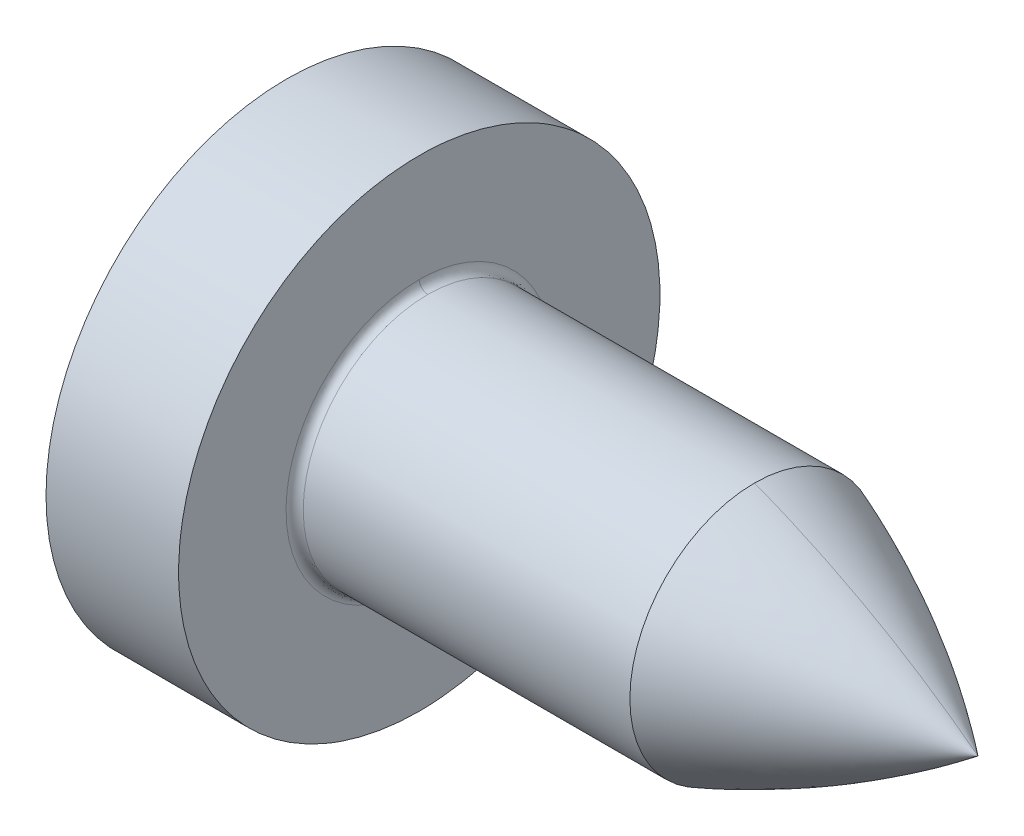
ISO-10303-21;
HEADER;
FILE_DESCRIPTION(('STEP AP214'),'2;1');
FILE_NAME('part.step','',(''),(''),'','','');
FILE_SCHEMA(('AUTOMOTIVE_DESIGN { 1 0 10303 214 1 1 1 1 }'));
ENDSEC;
DATA;
#1=APPLICATION_CONTEXT('core data for automotive mechanical design processes');
#2=APPLICATION_PROTOCOL_DEFINITION('international standard','automotive_design',2000,#1);
#3=PRODUCT_CONTEXT('',#1,'mechanical');
#4=PRODUCT('Part','Part','',(#3));
#5=PRODUCT_RELATED_PRODUCT_CATEGORY('part','',(#4));
#6=PRODUCT_DEFINITION_FORMATION('','',#4);
#7=PRODUCT_DEFINITION_CONTEXT('part definition',#1,'design');
#8=PRODUCT_DEFINITION('design','',#6,#7);
#9=PRODUCT_DEFINITION_SHAPE('','',#8);
#10=(LENGTH_UNIT() NAMED_UNIT(*) SI_UNIT(.MILLI.,.METRE.));
#11=(NAMED_UNIT(*) PLANE_ANGLE_UNIT() SI_UNIT($,.RADIAN.));
#12=(NAMED_UNIT(*) SI_UNIT($,.STERADIAN.) SOLID_ANGLE_UNIT());
#13=UNCERTAINTY_MEASURE_WITH_UNIT(LENGTH_MEASURE(1.E-05),#10,'distance_accuracy_value','');
#14=(GEOMETRIC_REPRESENTATION_CONTEXT(3) GLOBAL_UNCERTAINTY_ASSIGNED_CONTEXT((#13)) GLOBAL_UNIT_ASSIGNED_CONTEXT((#10,
#11,#12)) REPRESENTATION_CONTEXT('',''));
#15=CARTESIAN_POINT('',(0.,0.,0.));
#16=DIRECTION('',(0.,0.,1.));
#17=DIRECTION('',(1.,0.,0.));
#18=AXIS2_PLACEMENT_3D('',#15,#16,#17);
#19=CARTESIAN_POINT('',(1.75,-0.489637029,0.489637029));
#20=DIRECTION('',(1.,0.,0.));
#21=DIRECTION('',(0.,0.,-1.));
#22=AXIS2_PLACEMENT_3D('',#19,#20,#21);
#23=PLANE('',#22);
#24=DIRECTION('',(0.,0.,-1.));
#25=VECTOR('',#24,1.);
#26=CARTESIAN_POINT('',(1.75,0.3,-0.3));
#27=LINE('',#26,#25);
#28=CARTESIAN_POINT('',(1.75,0.3,-0.489637029));
#29=VERTEX_POINT('',#28);
#30=CARTESIAN_POINT('',(1.75,0.3,-0.3));
#31=VERTEX_POINT('',#30);
#32=EDGE_CURVE('E134',#29,#31,#27,.F.);
#33=ORIENTED_EDGE('',*,*,#32,.F.);
#34=DIRECTION('',(0.,1.,0.));
#35=VECTOR('',#34,1.);
#36=CARTESIAN_POINT('',(1.75,-0.3,-0.489637029));
#37=LINE('',#36,#35);
#38=CARTESIAN_POINT('',(1.75,-0.3,-0.489637029));
#39=VERTEX_POINT('',#38);
#40=EDGE_CURVE('E149',#39,#29,#37,.T.);
#41=ORIENTED_EDGE('',*,*,#40,.F.);
#42=DIRECTION('',(0.,0.,1.));
#43=VECTOR('',#42,1.);
#44=CARTESIAN_POINT('',(1.75,-0.3,-1.38860227));
#45=LINE('',#44,#43);
#46=CARTESIAN_POINT('',(1.75,-0.3,-0.3));
#47=VERTEX_POINT('',#46);
#48=EDGE_CURVE('E164',#47,#39,#45,.F.);
#49=ORIENTED_EDGE('',*,*,#48,.F.);
#50=DIRECTION('',(0.,-1.,0.));
#51=VECTOR('',#50,1.);
#52=CARTESIAN_POINT('',(1.75,-0.3,-0.3));
#53=LINE('',#52,#51);
#54=CARTESIAN_POINT('',(1.75,-0.489637029,-0.3));
#55=VERTEX_POINT('',#54);
#56=EDGE_CURVE('E172',#55,#47,#53,.F.);
#57=ORIENTED_EDGE('',*,*,#56,.F.);
#58=DIRECTION('',(0.,0.,1.));
#59=VECTOR('',#58,1.);
#60=CARTESIAN_POINT('',(1.75,-0.489637029,-0.3));
#61=LINE('',#60,#59);
#62=CARTESIAN_POINT('',(1.75,-0.489637029,0.3));
#63=VERTEX_POINT('',#62);
#64=EDGE_CURVE('E180',#63,#55,#61,.F.);
#65=ORIENTED_EDGE('',*,*,#64,.F.);
#66=DIRECTION('',(0.,1.,0.));
#67=VECTOR('',#66,1.);
#68=CARTESIAN_POINT('',(1.75,-1.38860227,0.3));
#69=LINE('',#68,#67);
#70=CARTESIAN_POINT('',(1.75,-0.3,0.3));
#71=VERTEX_POINT('',#70);
#72=EDGE_CURVE('E188',#71,#63,#69,.F.);
#73=ORIENTED_EDGE('',*,*,#72,.F.);
#74=DIRECTION('',(0.,0.,1.));
#75=VECTOR('',#74,1.);
#76=CARTESIAN_POINT('',(1.75,-0.3,0.3));
#77=LINE('',#76,#75);
#78=CARTESIAN_POINT('',(1.75,-0.3,0.489637029));
#79=VERTEX_POINT('',#78);
#80=EDGE_CURVE('E196',#79,#71,#77,.F.);
#81=ORIENTED_EDGE('',*,*,#80,.F.);
#82=DIRECTION('',(0.,1.,0.));
#83=VECTOR('',#82,1.);
#84=CARTESIAN_POINT('',(1.75,-0.3,0.489637029));
#85=LINE('',#84,#83);
#86=CARTESIAN_POINT('',(1.75,0.3,0.489637029));
#87=VERTEX_POINT('',#86);
#88=EDGE_CURVE('E204',#87,#79,#85,.F.);
#89=ORIENTED_EDGE('',*,*,#88,.F.);
#90=DIRECTION('',(0.,0.,-1.));
#91=VECTOR('',#90,1.);
#92=CARTESIAN_POINT('',(1.75,0.3,1.38860227));
#93=LINE('',#92,#91);
#94=CARTESIAN_POINT('',(1.75,0.3,0.3));
#95=VERTEX_POINT('',#94);
#96=EDGE_CURVE('E212',#95,#87,#93,.F.);
#97=ORIENTED_EDGE('',*,*,#96,.F.);
#98=DIRECTION('',(0.,1.,0.));
#99=VECTOR('',#98,1.);
#100=CARTESIAN_POINT('',(1.75,0.3,0.3));
#101=LINE('',#100,#99);
#102=CARTESIAN_POINT('',(1.75,0.489637029,0.3));
#103=VERTEX_POINT('',#102);
#104=EDGE_CURVE('E220',#103,#95,#101,.F.);
#105=ORIENTED_EDGE('',*,*,#104,.F.);
#106=DIRECTION('',(0.,0.,1.));
#107=VECTOR('',#106,1.);
#108=CARTESIAN_POINT('',(1.75,0.489637029,-0.3));
#109=LINE('',#108,#107);
#110=CARTESIAN_POINT('',(1.75,0.489637029,-0.3));
#111=VERTEX_POINT('',#110);
#112=EDGE_CURVE('E137',#111,#103,#109,.T.);
#113=ORIENTED_EDGE('',*,*,#112,.F.);
#114=DIRECTION('',(0.,-1.,0.));
#115=VECTOR('',#114,1.);
#116=CARTESIAN_POINT('',(1.75,1.38860227,-0.3));
#117=LINE('',#116,#115);
#118=EDGE_CURVE('E22',#31,#111,#117,.F.);
#119=ORIENTED_EDGE('',*,*,#118,.F.);
#120=EDGE_LOOP('',(#33,#41,#49,#57,#65,#73,#81,#89,#97,#105,#113,#119));
#121=FACE_BOUND('',#120,.T.);
#122=ADVANCED_FACE('F17',(#121),#23,.F.);
#123=CARTESIAN_POINT('',(0.007640712,1.38860227,-0.3));
#124=DIRECTION('',(0.,0.,1.));
#125=DIRECTION('',(0.,-1.,0.));
#126=AXIS2_PLACEMENT_3D('',#123,#124,#125);
#127=PLANE('',#126);
#128=ORIENTED_EDGE('',*,*,#118,.T.);
#129=DIRECTION('',(0.866025403776481,-0.500000000013782,0.));
#130=VECTOR('',#129,1.);
#131=CARTESIAN_POINT('',(0.186832105,1.392132434,-0.3));
#132=LINE('',#131,#130);
#133=CARTESIAN_POINT('',(0.204192136543813,1.38210961511467,-0.300000005057654));
#134=VERTEX_POINT('',#133);
#135=EDGE_CURVE('E228',#134,#111,#132,.T.);
#136=ORIENTED_EDGE('',*,*,#135,.F.);
#137=CARTESIAN_POINT('',(0.204192145400716,1.38210962725965,-0.3));
#138=CARTESIAN_POINT('',(0.191463387385379,1.33794250009717,-0.3));
#139=CARTESIAN_POINT('',(0.179345099389137,1.29359945410167,-0.3));
#140=CARTESIAN_POINT('',(0.156364101310373,1.20469663715095,-0.3));
#141=CARTESIAN_POINT('',(0.145498601955383,1.16013758719818,-0.3));
#142=CARTESIAN_POINT('',(0.125015443208429,1.07080460369255,-0.3));
#143=CARTESIAN_POINT('',(0.115395919605229,1.02603109757912,-0.3));
#144=CARTESIAN_POINT('',(0.0973995356519955,0.936270408464885,-0.3));
#145=CARTESIAN_POINT('',(0.0890217371712165,0.89128341355061,-0.3));
#146=CARTESIAN_POINT('',(0.0735064456092174,0.801096049043632,-0.3));
#147=CARTESIAN_POINT('',(0.0663689525279974,0.755895679450928,-0.3));
#148=CARTESIAN_POINT('',(0.0533347009533749,0.665281334937799,-0.3));
#149=CARTESIAN_POINT('',(0.0474388895119803,0.619867223788404,-0.3));
#150=CARTESIAN_POINT('',(0.036891377921522,0.528824971325505,-0.3));
#151=CARTESIAN_POINT('',(0.0322415776510665,0.483196609900054,-0.3));
#152=CARTESIAN_POINT('',(0.0241920568768406,0.391725071431656,-0.3));
#153=CARTESIAN_POINT('',(0.0207952062334372,0.345881641828002,-0.3));
#154=CARTESIAN_POINT('',(0.0180325178902483,0.300000012001697,-0.3));
#155=B_SPLINE_CURVE_WITH_KNOTS('',3,(#137,#138,#139,#140,#141,#142,#143,#144,#145,#146,#147,
#148,#149,#150,#151,#152,#153,#154),.UNSPECIFIED.,.F.,.F.,(4,2,2,2,2,2,2,2,4),(0.,
0.137889778040264,0.275466367691533,0.412834679138108,0.550098673118241,0.687362667098374,
0.824730978544949,0.962307568196218,1.10019734623648),.UNSPECIFIED.);
#156=CARTESIAN_POINT('',(0.0180325176455636,0.300000006000848,-0.3));
#157=VERTEX_POINT('',#156);
#158=EDGE_CURVE('E145',#134,#157,#155,.T.);
#159=ORIENTED_EDGE('',*,*,#158,.T.);
#160=DIRECTION('',(1.,0.,0.));
#161=VECTOR('',#160,1.);
#162=CARTESIAN_POINT('',(0.007640712,0.3,-0.3));
#163=LINE('',#162,#161);
#164=EDGE_CURVE('E142',#31,#157,#163,.F.);
#165=ORIENTED_EDGE('',*,*,#164,.F.);
#166=EDGE_LOOP('',(#128,#136,#159,#165));
#167=FACE_BOUND('',#166,.T.);
#168=ADVANCED_FACE('F143',(#167),#127,.T.);
#169=CARTESIAN_POINT('',(0.007640712,0.3,-0.3));
#170=DIRECTION('',(0.,-1.,0.));
#171=DIRECTION('',(0.,0.,-1.));
#172=AXIS2_PLACEMENT_3D('',#169,#170,#171);
#173=PLANE('',#172);
#174=ORIENTED_EDGE('',*,*,#32,.T.);
#175=ORIENTED_EDGE('',*,*,#164,.T.);
#176=CARTESIAN_POINT('',(0.0180325178854787,0.299999999999999,-0.300000011922494));
#177=CARTESIAN_POINT('',(0.0265822573073342,0.299999999999999,-0.442350741842299));
#178=CARTESIAN_POINT('',(0.0412757345976917,0.3,-0.58434877076873));
#179=CARTESIAN_POINT('',(0.0826542120601617,0.3,-0.865906856408898));
#180=CARTESIAN_POINT('',(0.109282675724778,0.3,-1.00547522135275));
#181=CARTESIAN_POINT('',(0.160629730936378,0.3,-1.2236331611432));
#182=CARTESIAN_POINT('',(0.181433121631465,0.3,-1.30315866849996));
#183=CARTESIAN_POINT('',(0.204192145406173,0.3,-1.38210962727859));
#184=B_SPLINE_CURVE_WITH_KNOTS('',3,(#176,#177,#178,#179,#180,#181,#182,#183),.UNSPECIFIED.,.F.,
.F.,(4,2,2,4),(0.,0.42772574094884,0.853446397968329,1.09994692993913),.UNSPECIFIED.);
#185=CARTESIAN_POINT('',(0.204192143290822,0.3,-1.38210961985958));
#186=VERTEX_POINT('',#185);
#187=EDGE_CURVE('E246',#157,#186,#184,.T.);
#188=ORIENTED_EDGE('',*,*,#187,.T.);
#189=DIRECTION('',(0.866025403776481,0.,0.500000000013782));
#190=VECTOR('',#189,1.);
#191=CARTESIAN_POINT('',(0.186832105,0.3,-1.392132434));
#192=LINE('',#191,#190);
#193=EDGE_CURVE('E153',#29,#186,#192,.F.);
#194=ORIENTED_EDGE('',*,*,#193,.F.);
#195=EDGE_LOOP('',(#174,#175,#188,#194));
#196=FACE_BOUND('',#195,.T.);
#197=ADVANCED_FACE('F151',(#196),#173,.T.);
#198=CARTESIAN_POINT('',(0.186832105,-0.3,-1.392132434));
#199=DIRECTION('',(-0.500000000013782,0.,0.866025403776481));
#200=DIRECTION('',(0.866025403776481,0.,0.500000000013782));
#201=AXIS2_PLACEMENT_3D('',#198,#199,#200);
#202=PLANE('',#201);
#203=ORIENTED_EDGE('',*,*,#40,.T.);
#204=ORIENTED_EDGE('',*,*,#193,.T.);
#205=CARTESIAN_POINT('',(0.204192141299821,0.30000000304568,-1.38210961236879));
#206=CARTESIAN_POINT('',(0.19883416324687,0.200000001998752,-1.38520304244008));
#207=CARTESIAN_POINT('',(0.196155174221242,0.100000000951884,-1.38674975747524));
#208=CARTESIAN_POINT('',(0.196155174224629,-0.100000001141731,-1.38674975747329));
#209=CARTESIAN_POINT('',(0.198834163253646,-0.200000002188477,-1.38520304243618));
#210=CARTESIAN_POINT('',(0.204192141309985,-0.300000003235164,-1.38210961236293));
#211=B_SPLINE_CURVE_WITH_KNOTS('',3,(#205,#206,#207,#208,#209,#210),.UNSPECIFIED.,.F.,.F.,(4,2,
4),(0.,0.300143508460131,0.600287016920263),.UNSPECIFIED.);
#212=CARTESIAN_POINT('',(0.204192141216119,-0.300000001617604,-1.38210961241711));
#213=VERTEX_POINT('',#212);
#214=EDGE_CURVE('E271',#186,#213,#211,.T.);
#215=ORIENTED_EDGE('',*,*,#214,.T.);
#216=DIRECTION('',(-0.866025403776481,0.,-0.500000000013782));
#217=VECTOR('',#216,1.);
#218=CARTESIAN_POINT('',(1.74999999999279,-0.3,-0.489637029004161));
#219=LINE('',#218,#217);
#220=EDGE_CURVE('E168',#39,#213,#219,.T.);
#221=ORIENTED_EDGE('',*,*,#220,.F.);
#222=EDGE_LOOP('',(#203,#204,#215,#221));
#223=FACE_BOUND('',#222,.T.);
#224=ADVANCED_FACE('F263',(#223),#202,.T.);
#225=CARTESIAN_POINT('',(0.007640712,-0.3,-1.38860227));
#226=DIRECTION('',(0.,1.,0.));
#227=DIRECTION('',(0.,0.,1.));
#228=AXIS2_PLACEMENT_3D('',#225,#226,#227);
#229=PLANE('',#228);
#230=ORIENTED_EDGE('',*,*,#48,.T.);
#231=ORIENTED_EDGE('',*,*,#220,.T.);
#232=CARTESIAN_POINT('',(0.204192145395258,-0.3,-1.38210962724071));
#233=CARTESIAN_POINT('',(0.191463387380087,-0.3,-1.33794250007815));
#234=CARTESIAN_POINT('',(0.179345099384013,-0.3,-1.29359945408257));
#235=CARTESIAN_POINT('',(0.156364101305585,-0.3,-1.2046966371317));
#236=CARTESIAN_POINT('',(0.145498601950764,-0.3,-1.16013758717885));
#237=CARTESIAN_POINT('',(0.125015443204153,-0.3,-1.07080460367308));
#238=CARTESIAN_POINT('',(0.115395919601125,-0.3,-1.02603109755958));
#239=CARTESIAN_POINT('',(0.0973995356482388,-0.3,-0.936270408445212));
#240=CARTESIAN_POINT('',(0.0890217371676343,-0.3,-0.891283413530873));
#241=CARTESIAN_POINT('',(0.0735064456059871,-0.3,-0.801096049023769));
#242=CARTESIAN_POINT('',(0.0663689525249444,-0.3,-0.755895679431005));
#243=CARTESIAN_POINT('',(0.0533347009506796,-0.3,-0.665281334917761));
#244=CARTESIAN_POINT('',(0.0474388895094651,-0.3,-0.61986722376831));
#245=CARTESIAN_POINT('',(0.0368913779193694,-0.3,-0.528824971305305));
#246=CARTESIAN_POINT('',(0.0322415776490963,-0.3,-0.483196609879803));
#247=CARTESIAN_POINT('',(0.0241920568752379,-0.3,-0.391725071411308));
#248=CARTESIAN_POINT('',(0.0207952062320198,-0.3,-0.345881641807608));
#249=CARTESIAN_POINT('',(0.0180325178890176,-0.3,-0.30000001198126));
#250=B_SPLINE_CURVE_WITH_KNOTS('',3,(#232,#233,#234,#235,#236,#237,#238,#239,#240,#241,#242,
#243,#244,#245,#246,#247,#248,#249),.UNSPECIFIED.,.F.,.F.,(4,2,2,2,2,2,2,2,4),(0.,
0.137889778040361,0.275466367691726,0.412834679138397,0.550098673118625,0.687362667098853,
0.824730978545524,0.962307568196888,1.10019734623725),.UNSPECIFIED.);
#251=CARTESIAN_POINT('',(0.0180325176449482,-0.299999999999999,-0.30000000599063));
#252=VERTEX_POINT('',#251);
#253=EDGE_CURVE('E278',#213,#252,#250,.T.);
#254=ORIENTED_EDGE('',*,*,#253,.T.);
#255=DIRECTION('',(1.,0.,0.));
#256=VECTOR('',#255,1.);
#257=CARTESIAN_POINT('',(0.007640712,-0.3,-0.3));
#258=LINE('',#257,#256);
#259=EDGE_CURVE('E176',#47,#252,#258,.F.);
#260=ORIENTED_EDGE('',*,*,#259,.F.);
#261=EDGE_LOOP('',(#230,#231,#254,#260));
#262=FACE_BOUND('',#261,.T.);
#263=ADVANCED_FACE('F267',(#262),#229,.T.);
#264=CARTESIAN_POINT('',(0.007640712,-0.3,-0.3));
#265=DIRECTION('',(0.,0.,1.));
#266=DIRECTION('',(0.,-1.,0.));
#267=AXIS2_PLACEMENT_3D('',#264,#265,#266);
#268=PLANE('',#267);
#269=ORIENTED_EDGE('',*,*,#56,.T.);
#270=ORIENTED_EDGE('',*,*,#259,.T.);
#271=CARTESIAN_POINT('',(0.0180325178867095,-0.300000011942931,-0.3));
#272=CARTESIAN_POINT('',(0.0265822573094413,-0.442350741867617,-0.3));
#273=CARTESIAN_POINT('',(0.041275734601102,-0.584348770798885,-0.3));
#274=CARTESIAN_POINT('',(0.0826542120669903,-0.865906856448473,-0.3));
#275=CARTESIAN_POINT('',(0.109282675733715,-1.00547522139691,-0.3));
#276=CARTESIAN_POINT('',(0.160629730946309,-1.22363316118179,-0.3));
#277=CARTESIAN_POINT('',(0.1814331216394,-1.30315866852866,-0.3));
#278=CARTESIAN_POINT('',(0.204192145411631,-1.38210962729753,-0.3));
#279=B_SPLINE_CURVE_WITH_KNOTS('',3,(#271,#272,#273,#274,#275,#276,#277,#278),.UNSPECIFIED.,.F.,
.F.,(4,2,2,4),(0.,0.427725740963614,0.85344639799774,1.09994692993835),.UNSPECIFIED.);
#280=CARTESIAN_POINT('',(0.204192143293551,-1.38210961986905,-0.3));
#281=VERTEX_POINT('',#280);
#282=EDGE_CURVE('E285',#252,#281,#279,.T.);
#283=ORIENTED_EDGE('',*,*,#282,.T.);
#284=DIRECTION('',(-0.866025403776481,-0.500000000013782,0.));
#285=VECTOR('',#284,1.);
#286=CARTESIAN_POINT('',(1.75,-0.489637029,-0.3));
#287=LINE('',#286,#285);
#288=EDGE_CURVE('E184',#55,#281,#287,.T.);
#289=ORIENTED_EDGE('',*,*,#288,.F.);
#290=EDGE_LOOP('',(#269,#270,#283,#289));
#291=FACE_BOUND('',#290,.T.);
#292=ADVANCED_FACE('F300',(#291),#268,.T.);
#293=CARTESIAN_POINT('',(1.75,-0.489637029,-0.3));
#294=DIRECTION('',(-0.500000000013782,0.866025403776481,0.));
#295=DIRECTION('',(-0.866025403776481,-0.500000000013782,0.));
#296=AXIS2_PLACEMENT_3D('',#293,#294,#295);
#297=PLANE('',#296);
#298=ORIENTED_EDGE('',*,*,#64,.T.);
#299=ORIENTED_EDGE('',*,*,#288,.T.);
#300=CARTESIAN_POINT('',(0.204192131858866,-1.38210961781953,-0.300000009548356));
#301=CARTESIAN_POINT('',(0.196155164116408,-1.38674976330927,-0.150143544062612));
#302=CARTESIAN_POINT('',(0.196155164143077,-1.38674976329388,5.6885426273981E-10));
#303=B_SPLINE_CURVE_WITH_KNOTS('',2,(#300,#301,#302),.UNSPECIFIED.,.F.,.F.,(3,3),(0.,1.),.UNSPECIFIED.);
#304=CARTESIAN_POINT('',(0.196155169183007,-1.38674976038407,5.68854261120681E-10));
#305=VERTEX_POINT('',#304);
#306=EDGE_CURVE('E292',#281,#305,#303,.T.);
#307=ORIENTED_EDGE('',*,*,#306,.T.);
#308=CARTESIAN_POINT('',(0.196155164143077,-1.38674976329388,5.6885426273981E-10));
#309=CARTESIAN_POINT('',(0.196155164169747,-1.38674976327848,0.150143543995877));
#310=CARTESIAN_POINT('',(0.204192131835537,-1.382109617833,0.300000009300148));
#311=B_SPLINE_CURVE_WITH_KNOTS('',2,(#308,#309,#310),.UNSPECIFIED.,.F.,.F.,(3,3),(0.,1.),.UNSPECIFIED.);
#312=CARTESIAN_POINT('',(0.204192136478894,-1.38210961515215,0.300000004650074));
#313=VERTEX_POINT('',#312);
#314=EDGE_CURVE('E314',#305,#313,#311,.T.);
#315=ORIENTED_EDGE('',*,*,#314,.T.);
#316=DIRECTION('',(-0.866025403776482,-0.500000000013782,0.));
#317=VECTOR('',#316,1.);
#318=CARTESIAN_POINT('',(1.74999999999279,-0.48963702900416,0.3));
#319=LINE('',#318,#317);
#320=EDGE_CURVE('E192',#63,#313,#319,.T.);
#321=ORIENTED_EDGE('',*,*,#320,.F.);
#322=EDGE_LOOP('',(#298,#299,#307,#315,#321));
#323=FACE_BOUND('',#322,.T.);
#324=ADVANCED_FACE('F304',(#323),#297,.T.);
#325=CARTESIAN_POINT('',(0.007640712,-1.38860227,0.3));
#326=DIRECTION('',(0.,0.,-1.));
#327=DIRECTION('',(0.,1.,0.));
#328=AXIS2_PLACEMENT_3D('',#325,#326,#327);
#329=PLANE('',#328);
#330=ORIENTED_EDGE('',*,*,#72,.T.);
#331=ORIENTED_EDGE('',*,*,#320,.T.);
#332=CARTESIAN_POINT('',(0.20419214541641,-1.38210962731411,0.300000000000001));
#333=CARTESIAN_POINT('',(0.191463387399435,-1.33794250014783,0.3));
#334=CARTESIAN_POINT('',(0.179345099401664,-1.2935994541485,0.3));
#335=CARTESIAN_POINT('',(0.156364101320064,-1.20469663719007,0.3));
#336=CARTESIAN_POINT('',(0.145498601963767,-1.16013758723342,0.3));
#337=CARTESIAN_POINT('',(0.125015443214423,-1.07080460372001,0.3));
#338=CARTESIAN_POINT('',(0.115395919610137,-1.02603109760266,0.3));
#339=CARTESIAN_POINT('',(0.0973995356549516,-0.936270408480561,0.3));
#340=CARTESIAN_POINT('',(0.0890217371733062,-0.891283413562333,0.3));
#341=CARTESIAN_POINT('',(0.0735064456097936,-0.801096049047407,0.3));
#342=CARTESIAN_POINT('',(0.0663689525279263,-0.75589567945071,0.3));
#343=CARTESIAN_POINT('',(0.0533347009522287,-0.665281334929555,0.3));
#344=CARTESIAN_POINT('',(0.0474388895104063,-0.619867223776126,0.3));
#345=CARTESIAN_POINT('',(0.0368913779193125,-0.528824971305121,0.3));
#346=CARTESIAN_POINT('',(0.0322415776486497,-0.483196609875597,0.3));
#347=CARTESIAN_POINT('',(0.0241920568742321,-0.391725071399012,0.3));
#348=CARTESIAN_POINT('',(0.0207952062308452,-0.345881641791245,0.3));
#349=CARTESIAN_POINT('',(0.0180325178877868,-0.300000011960825,0.3));
#350=B_SPLINE_CURVE_WITH_KNOTS('',3,(#332,#333,#334,#335,#336,#337,#338,#339,#340,#341,#342,
#343,#344,#345,#346,#347,#348,#349),.UNSPECIFIED.,.F.,.F.,(4,2,2,2,2,2,2,2,4),(0.,
0.137889778052563,0.275466367716046,0.412834679174781,0.550098673167046,0.68736266715931,
0.824730978618045,0.962307568281528,1.10019734633409),.UNSPECIFIED.);
#351=CARTESIAN_POINT('',(0.0180325176443328,-0.300000005980412,0.3));
#352=VERTEX_POINT('',#351);
#353=EDGE_CURVE('E293',#313,#352,#350,.T.);
#354=ORIENTED_EDGE('',*,*,#353,.T.);
#355=DIRECTION('',(1.,0.,0.));
#356=VECTOR('',#355,1.);
#357=CARTESIAN_POINT('',(0.007640712,-0.3,0.3));
#358=LINE('',#357,#356);
#359=EDGE_CURVE('E200',#71,#352,#358,.F.);
#360=ORIENTED_EDGE('',*,*,#359,.F.);
#361=EDGE_LOOP('',(#330,#331,#354,#360));
#362=FACE_BOUND('',#361,.T.);
#363=ADVANCED_FACE('F308',(#362),#329,.T.);
#364=CARTESIAN_POINT('',(0.007640712,-0.3,0.3));
#365=DIRECTION('',(0.,1.,0.));
#366=DIRECTION('',(0.,0.,1.));
#367=AXIS2_PLACEMENT_3D('',#364,#365,#366);
#368=PLANE('',#367);
#369=ORIENTED_EDGE('',*,*,#80,.T.);
#370=ORIENTED_EDGE('',*,*,#359,.T.);
#371=CARTESIAN_POINT('',(0.0180325178879394,-0.299999999999999,0.300000011963366));
#372=CARTESIAN_POINT('',(0.0265822573115483,-0.3,0.442350741892932));
#373=CARTESIAN_POINT('',(0.0412757346045123,-0.3,0.584348770829036));
#374=CARTESIAN_POINT('',(0.0826542120738179,-0.3,0.865906856488043));
#375=CARTESIAN_POINT('',(0.109282675742651,-0.3,1.00547522144106));
#376=CARTESIAN_POINT('',(0.160629730956238,-0.3,1.22363316122038));
#377=CARTESIAN_POINT('',(0.181433121647335,-0.3,1.30315866855736));
#378=CARTESIAN_POINT('',(0.204192145417089,-0.3,1.38210962731646));
#379=B_SPLINE_CURVE_WITH_KNOTS('',3,(#371,#372,#373,#374,#375,#376,#377,#378),.UNSPECIFIED.,.F.,
.F.,(4,2,2,4),(0.,0.427725740978385,0.853446398027146,1.09994692993756),.UNSPECIFIED.);
#380=CARTESIAN_POINT('',(0.20419214329628,-0.3,1.38210961987852));
#381=VERTEX_POINT('',#380);
#382=EDGE_CURVE('E992',#352,#381,#379,.T.);
#383=ORIENTED_EDGE('',*,*,#382,.T.);
#384=DIRECTION('',(-0.866025403776481,0.,0.500000000013782));
#385=VECTOR('',#384,1.);
#386=CARTESIAN_POINT('',(1.75,-0.3,0.489637029));
#387=LINE('',#386,#385);
#388=EDGE_CURVE('E208',#79,#381,#387,.T.);
#389=ORIENTED_EDGE('',*,*,#388,.F.);
#390=EDGE_LOOP('',(#369,#370,#383,#389));
#391=FACE_BOUND('',#390,.T.);
#392=ADVANCED_FACE('F445',(#391),#368,.T.);
#393=CARTESIAN_POINT('',(1.75,-0.3,0.489637029));
#394=DIRECTION('',(-0.500000000013782,0.,-0.866025403776481));
#395=DIRECTION('',(-0.866025403776481,0.,0.500000000013782));
#396=AXIS2_PLACEMENT_3D('',#393,#394,#395);
#397=PLANE('',#396);
#398=ORIENTED_EDGE('',*,*,#88,.T.);
#399=ORIENTED_EDGE('',*,*,#388,.T.);
#400=CARTESIAN_POINT('',(0.204192141289657,-0.300000002856153,1.38210961237466));
#401=CARTESIAN_POINT('',(0.198834163244223,-0.200000001886282,1.38520304244161));
#402=CARTESIAN_POINT('',(0.196155174221983,-0.100000000916446,1.38674975747482));
#403=CARTESIAN_POINT('',(0.196155174223888,0.10000000102316,1.38674975747372));
#404=CARTESIAN_POINT('',(0.198834163248033,0.200000001992929,1.38520304243942));
#405=CARTESIAN_POINT('',(0.204192141295371,0.300000002962663,1.38210961237136));
#406=B_SPLINE_CURVE_WITH_KNOTS('',3,(#400,#401,#402,#403,#404,#405),.UNSPECIFIED.,.F.,.F.,(4,2,
4),(0.,0.300143508228786,0.600287016457572),.UNSPECIFIED.);
#407=CARTESIAN_POINT('',(0.204192141208812,0.300000001481353,1.38210961242133));
#408=VERTEX_POINT('',#407);
#409=EDGE_CURVE('E997',#381,#408,#406,.T.);
#410=ORIENTED_EDGE('',*,*,#409,.T.);
#411=DIRECTION('',(-0.866025403776482,0.,0.500000000013782));
#412=VECTOR('',#411,1.);
#413=CARTESIAN_POINT('',(1.74999999999279,0.3,0.48963702900416));
#414=LINE('',#413,#412);
#415=EDGE_CURVE('E216',#87,#408,#414,.T.);
#416=ORIENTED_EDGE('',*,*,#415,.F.);
#417=EDGE_LOOP('',(#398,#399,#410,#416));
#418=FACE_BOUND('',#417,.T.);
#419=ADVANCED_FACE('F435',(#418),#397,.T.);
#420=CARTESIAN_POINT('',(0.007640712,0.3,1.38860227));
#421=DIRECTION('',(0.,-1.,0.));
#422=DIRECTION('',(0.,0.,-1.));
#423=AXIS2_PLACEMENT_3D('',#420,#421,#422);
#424=PLANE('',#423);
#425=ORIENTED_EDGE('',*,*,#96,.T.);
#426=ORIENTED_EDGE('',*,*,#415,.T.);
#427=CARTESIAN_POINT('',(0.204192145410951,0.3,1.38210962729517));
#428=CARTESIAN_POINT('',(0.191463387394144,0.3,1.33794250012881));
#429=CARTESIAN_POINT('',(0.17934509939654,0.3,1.2935994541294));
#430=CARTESIAN_POINT('',(0.156364101315275,0.3,1.20469663717081));
#431=CARTESIAN_POINT('',(0.145498601959148,0.3,1.1601375872141));
#432=CARTESIAN_POINT('',(0.125015443210145,0.3,1.07080460370054));
#433=CARTESIAN_POINT('',(0.115395919606032,0.3,1.02603109758312));
#434=CARTESIAN_POINT('',(0.0973995356511942,0.3,0.936270408460887));
#435=CARTESIAN_POINT('',(0.089021737169724,0.3,0.891283413542594));
#436=CARTESIAN_POINT('',(0.0735064456065636,0.3,0.801096049027544));
#437=CARTESIAN_POINT('',(0.0663689525248734,0.3,0.755895679430786));
#438=CARTESIAN_POINT('',(0.0533347009495331,0.3,0.665281334909515));
#439=CARTESIAN_POINT('',(0.047438889507891,0.3,0.619867223756032));
#440=CARTESIAN_POINT('',(0.0368913779171598,0.3,0.52882497128492));
#441=CARTESIAN_POINT('',(0.0322415776466795,0.3,0.483196609855345));
#442=CARTESIAN_POINT('',(0.0241920568726294,0.3,0.391725071378664));
#443=CARTESIAN_POINT('',(0.0207952062294277,0.3,0.345881641770851));
#444=CARTESIAN_POINT('',(0.018032517886556,0.3,0.300000011940387));
#445=B_SPLINE_CURVE_WITH_KNOTS('',3,(#427,#428,#429,#430,#431,#432,#433,#434,#435,#436,#437,
#438,#439,#440,#441,#442,#443,#444),.UNSPECIFIED.,.F.,.F.,(4,2,2,2,2,2,2,2,4),(0.,
0.137889778052659,0.275466367716238,0.412834679175069,0.550098673167428,0.687362667159788,
0.824730978618618,0.962307568282197,1.10019734633486),.UNSPECIFIED.);
#446=CARTESIAN_POINT('',(0.0180325176437175,0.299999999999999,0.300000005970194));
#447=VERTEX_POINT('',#446);
#448=EDGE_CURVE('E372',#408,#447,#445,.T.);
#449=ORIENTED_EDGE('',*,*,#448,.T.);
#450=DIRECTION('',(1.,0.,0.));
#451=VECTOR('',#450,1.);
#452=CARTESIAN_POINT('',(0.007640712,0.3,0.3));
#453=LINE('',#452,#451);
#454=EDGE_CURVE('E224',#95,#447,#453,.F.);
#455=ORIENTED_EDGE('',*,*,#454,.F.);
#456=EDGE_LOOP('',(#425,#426,#449,#455));
#457=FACE_BOUND('',#456,.T.);
#458=ADVANCED_FACE('F383',(#457),#424,.T.);
#459=CARTESIAN_POINT('',(0.007640712,0.3,0.3));
#460=DIRECTION('',(0.,0.,-1.));
#461=DIRECTION('',(0.,1.,0.));
#462=AXIS2_PLACEMENT_3D('',#459,#460,#461);
#463=PLANE('',#462);
#464=ORIENTED_EDGE('',*,*,#104,.T.);
#465=ORIENTED_EDGE('',*,*,#454,.T.);
#466=CARTESIAN_POINT('',(0.0180325178891702,0.300000011983803,0.3));
#467=CARTESIAN_POINT('',(0.0265822573136543,0.442350741918211,0.3));
#468=CARTESIAN_POINT('',(0.0412757346079174,0.584348770859127,0.3));
#469=CARTESIAN_POINT('',(0.0826542120806359,0.865906856527564,0.3));
#470=CARTESIAN_POINT('',(0.109282675751582,1.0054752214852,0.299999999999999));
#471=CARTESIAN_POINT('',(0.16062973095883,1.2236331612278,0.299999999999999));
#472=CARTESIAN_POINT('',(0.181433121639055,1.30315866852407,0.3));
#473=CARTESIAN_POINT('',(0.204192145395937,1.38210962724307,0.3));
#474=B_SPLINE_CURVE_WITH_KNOTS('',3,(#466,#467,#468,#469,#470,#471,#472,#473),.UNSPECIFIED.,.F.,
.F.,(4,2,2,4),(0.,0.427725740993071,0.853446398056555,1.09994692984072),.UNSPECIFIED.);
#475=CARTESIAN_POINT('',(0.204192143285705,1.38210961984183,0.3));
#476=VERTEX_POINT('',#475);
#477=EDGE_CURVE('E364',#447,#476,#474,.T.);
#478=ORIENTED_EDGE('',*,*,#477,.T.);
#479=DIRECTION('',(0.866025403776481,-0.500000000013782,0.));
#480=VECTOR('',#479,1.);
#481=CARTESIAN_POINT('',(0.186832105,1.392132434,0.3));
#482=LINE('',#481,#480);
#483=EDGE_CURVE('E233',#103,#476,#482,.F.);
#484=ORIENTED_EDGE('',*,*,#483,.F.);
#485=EDGE_LOOP('',(#464,#465,#478,#484));
#486=FACE_BOUND('',#485,.T.);
#487=ADVANCED_FACE('F379',(#486),#463,.T.);
#488=CARTESIAN_POINT('',(0.186832105,1.392132434,-0.3));
#489=DIRECTION('',(-0.500000000013782,-0.866025403776481,0.));
#490=DIRECTION('',(0.866025403776481,-0.500000000013782,0.));
#491=AXIS2_PLACEMENT_3D('',#488,#489,#490);
#492=PLANE('',#491);
#493=ORIENTED_EDGE('',*,*,#112,.T.);
#494=ORIENTED_EDGE('',*,*,#483,.T.);
#495=CARTESIAN_POINT('',(0.204192131935482,1.38210961777529,0.300000010363515));
#496=CARTESIAN_POINT('',(0.196155164143077,1.38674976329388,0.150143544662811));
#497=CARTESIAN_POINT('',(0.196155164143077,1.38674976329388,2.49041347440138E-10));
#498=B_SPLINE_CURVE_WITH_KNOTS('',2,(#495,#496,#497),.UNSPECIFIED.,.F.,.F.,(3,3),(0.,1.),.UNSPECIFIED.);
#499=CARTESIAN_POINT('',(0.196155164143077,1.38674976329388,1.24520673720069E-10));
#500=VERTEX_POINT('',#499);
#501=EDGE_CURVE('E363',#476,#500,#498,.T.);
#502=ORIENTED_EDGE('',*,*,#501,.T.);
#503=CARTESIAN_POINT('',(0.196155164143077,1.38674976329388,0.));
#504=CARTESIAN_POINT('',(0.196155164143077,1.38674976329388,-0.150143544631471));
#505=CARTESIAN_POINT('',(0.204192131912153,1.38210961778876,-0.300000010115307));
#506=B_SPLINE_CURVE_WITH_KNOTS('',2,(#503,#504,#505),.UNSPECIFIED.,.F.,.F.,(3,3),(0.,1.),.UNSPECIFIED.);
#507=EDGE_CURVE('E237',#500,#134,#506,.T.);
#508=ORIENTED_EDGE('',*,*,#507,.T.);
#509=ORIENTED_EDGE('',*,*,#135,.T.);
#510=EDGE_LOOP('',(#493,#494,#502,#508,#509));
#511=FACE_BOUND('',#510,.T.);
#512=ADVANCED_FACE('F382',(#511),#492,.T.);
#513=CARTESIAN_POINT('',(5.,0.,0.));
#514=DIRECTION('',(-1.,0.,0.));
#515=DIRECTION('',(0.,-1.,0.));
#516=AXIS2_PLACEMENT_3D('',#513,#514,#515);
#517=SPHERICAL_SURFACE('',#516,5.);
#518=CARTESIAN_POINT('',(0.857536991406852,0.,0.));
#519=DIRECTION('',(-1.,0.,0.));
#520=DIRECTION('',(0.,1.,0.));
#521=AXIS2_PLACEMENT_3D('',#518,#519,#520);
#522=CIRCLE('',#521,2.80000003972096);
#523=CARTESIAN_POINT('',(0.857536991406852,2.80000003972096,0.));
#524=VERTEX_POINT('',#523);
#525=EDGE_CURVE('E357',#524,#524,#522,.T.);
#526=ORIENTED_EDGE('',*,*,#525,.T.);
#527=EDGE_LOOP('',(#526));
#528=FACE_BOUND('',#527,.T.);
#529=ORIENTED_EDGE('',*,*,#507,.F.);
#530=ORIENTED_EDGE('',*,*,#501,.F.);
#531=ORIENTED_EDGE('',*,*,#477,.F.);
#532=ORIENTED_EDGE('',*,*,#448,.F.);
#533=ORIENTED_EDGE('',*,*,#409,.F.);
#534=ORIENTED_EDGE('',*,*,#382,.F.);
#535=ORIENTED_EDGE('',*,*,#353,.F.);
#536=ORIENTED_EDGE('',*,*,#314,.F.);
#537=ORIENTED_EDGE('',*,*,#306,.F.);
#538=ORIENTED_EDGE('',*,*,#282,.F.);
#539=ORIENTED_EDGE('',*,*,#253,.F.);
#540=ORIENTED_EDGE('',*,*,#214,.F.);
#541=ORIENTED_EDGE('',*,*,#187,.F.);
#542=ORIENTED_EDGE('',*,*,#158,.F.);
#543=EDGE_LOOP('',(#529,#530,#531,#532,#533,#534,#535,#536,#537,#538,#539,#540,#541,#542));
#544=FACE_BOUND('',#543,.T.);
#545=ADVANCED_FACE('F253',(#528,#544),#517,.T.);
#546=CARTESIAN_POINT('',(2.4,-2.8,0.));
#547=CARTESIAN_POINT('',(0.857536965,-2.8,0.));
#548=(BOUNDED_CURVE() B_SPLINE_CURVE(1,(#546,#547),.UNSPECIFIED.,.F.,
.F.) B_SPLINE_CURVE_WITH_KNOTS((2,2),(0.,1.),
.UNSPECIFIED.) CURVE() GEOMETRIC_REPRESENTATION_ITEM() RATIONAL_B_SPLINE_CURVE((1.,1.)) REPRESENTATION_ITEM(''));
#549=CARTESIAN_POINT('',(-65.54753617,0.,0.));
#550=DIRECTION('',(-1.,0.,0.));
#551=AXIS1_PLACEMENT('',#549,#550);
#552=SURFACE_OF_REVOLUTION('',#548,#551);
#553=ORIENTED_EDGE('',*,*,#525,.F.);
#554=EDGE_LOOP('',(#553));
#555=FACE_BOUND('',#554,.T.);
#556=CARTESIAN_POINT('',(2.4,-2.8,-1.67612743368865E-10));
#557=CARTESIAN_POINT('',(2.4,-2.79999657197557,0.130092074601372));
#558=CARTESIAN_POINT('',(2.4,-2.79091000933436,0.260256494053905));
#559=CARTESIAN_POINT('',(2.4,-2.75472167594771,0.518183811217375));
#560=CARTESIAN_POINT('',(2.4,-2.72759486860614,0.645943117323461));
#561=CARTESIAN_POINT('',(2.4,-2.64833529367665,0.922525645863484));
#562=CARTESIAN_POINT('',(2.4,-2.59218084788675,1.07021665492332));
#563=CARTESIAN_POINT('',(2.4,-2.45586778489074,1.35407809022953));
#564=CARTESIAN_POINT('',(2.4,-2.37570342560092,1.49024575061067));
#565=CARTESIAN_POINT('',(2.4,-2.19365577248362,1.74718479233381));
#566=CARTESIAN_POINT('',(2.4,-2.09177445961684,1.86795757634943));
#567=CARTESIAN_POINT('',(2.4,-1.86918828675014,2.09067528383011));
#568=CARTESIAN_POINT('',(2.4,-1.74848449884175,2.19262127891048));
#569=CARTESIAN_POINT('',(2.4,-1.49167211842503,2.37480524984278));
#570=CARTESIAN_POINT('',(2.4,-1.355563169952,2.45504272393392));
#571=CARTESIAN_POINT('',(2.4,-1.0718049822975,2.59152877099735));
#572=CARTESIAN_POINT('',(2.4,-0.924155619452849,2.64777708686825));
#573=CARTESIAN_POINT('',(2.4,-0.621510015835157,2.73468682326539));
#574=CARTESIAN_POINT('',(2.4,-0.466513812835058,2.765348375328));
#575=CARTESIAN_POINT('',(2.4,-0.153573784019005,2.8002146125671));
#576=CARTESIAN_POINT('',(2.4,0.00437004051364576,2.8044193092618));
#577=CARTESIAN_POINT('',(2.4,0.318721412027845,2.78625255673916));
#578=CARTESIAN_POINT('',(2.4,0.475128962969481,2.76388117604571));
#579=CARTESIAN_POINT('',(2.4,0.781969136284616,2.69319719693483));
#580=CARTESIAN_POINT('',(2.4,0.932401725240397,2.64488445345036));
#581=CARTESIAN_POINT('',(2.4,1.22302453814657,2.52368765334353));
#582=CARTESIAN_POINT('',(2.4,1.36321449086583,2.45080294632762));
#583=CARTESIAN_POINT('',(2.4,1.62936005085085,2.28253600333796));
#584=CARTESIAN_POINT('',(2.4,1.75531649080974,2.18715508445307));
#585=CARTESIAN_POINT('',(2.4,1.98941270418348,1.9766176346236));
#586=CARTESIAN_POINT('',(2.4,2.09755494912847,1.86146385148896));
#587=CARTESIAN_POINT('',(2.4,2.29300877617889,1.61458997046069));
#588=CARTESIAN_POINT('',(2.4,2.38031334079791,1.48286431441487));
#589=CARTESIAN_POINT('',(2.4,2.53160946431228,1.2065620898893));
#590=CARTESIAN_POINT('',(2.4,2.59558682077953,1.06197775899937));
#591=CARTESIAN_POINT('',(2.4,2.69826340638966,0.7642615298457));
#592=CARTESIAN_POINT('',(2.4,2.73700168522361,0.611143235673842));
#593=CARTESIAN_POINT('',(2.4,2.77505905939495,0.380661115380231));
#594=CARTESIAN_POINT('',(2.4,2.78440503590117,0.30482878341501));
#595=CARTESIAN_POINT('',(2.4,2.79687551446216,0.15267249624623));
#596=CARTESIAN_POINT('',(2.4,2.80000201187155,0.0763487066001442));
#597=CARTESIAN_POINT('',(2.4,2.79999657193222,-0.130092075535274));
#598=CARTESIAN_POINT('',(2.4,2.79091000924757,-0.26025649498492));
#599=CARTESIAN_POINT('',(2.4,2.75472167577485,-0.518183812136181));
#600=CARTESIAN_POINT('',(2.4,2.72759486839074,-0.64594311823295));
#601=CARTESIAN_POINT('',(2.4,2.64833529336917,-0.922525646746191));
#602=CARTESIAN_POINT('',(2.4,2.59218084753009,-1.0702166557872));
#603=CARTESIAN_POINT('',(2.4,2.45586778443948,-1.35407809104798));
#604=CARTESIAN_POINT('',(2.4,2.37570342510423,-1.49024575140249));
#605=CARTESIAN_POINT('',(2.4,2.19365577190122,-1.74718479306505));
#606=CARTESIAN_POINT('',(2.4,2.09177445899416,-1.86795757704672));
#607=CARTESIAN_POINT('',(2.4,1.86918828605322,-2.09067528445319));
#608=CARTESIAN_POINT('',(2.4,1.74848449811086,-2.19262127949332));
#609=CARTESIAN_POINT('',(2.4,1.49167211763343,-2.37480525034));
#610=CARTESIAN_POINT('',(2.4,1.35556316913366,-2.45504272438577));
#611=CARTESIAN_POINT('',(2.4,1.07180498143366,-2.59152877135461));
#612=CARTESIAN_POINT('',(2.4,0.924155618570261,-2.6477770871763));
#613=CARTESIAN_POINT('',(2.4,0.621510014923595,-2.73468682347256));
#614=CARTESIAN_POINT('',(2.4,0.466513811913276,-2.7653483754835));
#615=CARTESIAN_POINT('',(2.4,0.153573783085602,-2.80021461261829));
#616=CARTESIAN_POINT('',(2.4,-0.00437004144845094,-2.80441930926035));
#617=CARTESIAN_POINT('',(2.4,-0.318721412956591,-2.78625255663292));
#618=CARTESIAN_POINT('',(2.4,-0.475128963890766,-2.76388117588734));
#619=CARTESIAN_POINT('',(2.4,-0.781969137182341,-2.69319719667418));
#620=CARTESIAN_POINT('',(2.4,-0.93240172612202,-2.64488445313956));
#621=CARTESIAN_POINT('',(2.4,-1.22302453898782,-2.52368765293585));
#622=CARTESIAN_POINT('',(2.4,-1.36321449168281,-2.4508029458732));
#623=CARTESIAN_POINT('',(2.4,-1.62936005161173,-2.28253600279481));
#624=CARTESIAN_POINT('',(2.4,-1.7553164915388,-2.18715508386795));
#625=CARTESIAN_POINT('',(2.4,-1.98941270484227,-1.97661763396054));
#626=CARTESIAN_POINT('',(2.4,-2.0975549497488,-1.86146385078995));
#627=CARTESIAN_POINT('',(2.4,-2.29300877671697,-1.61458996969654));
#628=CARTESIAN_POINT('',(2.4,-2.38031334129215,-1.48286431362151));
#629=CARTESIAN_POINT('',(2.4,-2.5316094647147,-1.20656208904503));
#630=CARTESIAN_POINT('',(2.4,-2.5955868211339,-1.06197775813337));
#631=CARTESIAN_POINT('',(2.4,-2.69826340664467,-0.764261528945241));
#632=CARTESIAN_POINT('',(2.4,-2.73700168542747,-0.61114323476068));
#633=CARTESIAN_POINT('',(2.4,-2.77505905947112,-0.380661114762349));
#634=CARTESIAN_POINT('',(2.4,-2.78440503592656,-0.304828783105146));
#635=CARTESIAN_POINT('',(2.4,-2.79687551443674,-0.152672496556441));
#636=CARTESIAN_POINT('',(2.4,-2.8000020118461,-0.0763487072224098));
#637=CARTESIAN_POINT('',(2.4,-2.8,-1.67612743368865E-10));
#638=B_SPLINE_CURVE_WITH_KNOTS('',3,(#556,#557,#558,#559,#560,#561,#562,#563,#564,#565,#566,
#567,#568,#569,#570,#571,#572,#573,#574,#575,#576,#577,#578,#579,#580,#581,#582,#583,#584,#585,
#586,#587,#588,#589,#590,#591,#592,#593,#594,#595,#596,#597,#598,#599,#600,#601,#602,#603,#604,
#605,#606,#607,#608,#609,#610,#611,#612,#613,#614,#615,#616,#617,#618,#619,#620,#621,#622,#623,
#624,#625,#626,#627,#628,#629,#630,#631,#632,#633,#634,#635,#636,#637),.UNSPECIFIED.,.T.,.F.,(4,
2,2,2,2,2,2,2,2,2,2,2,2,2,2,2,2,2,2,2,2,2,2,2,2,2,2,2,2,2,2,2,2,2,2,2,2,2,2,2,4),(0.,
0.390078032138311,0.780698554903849,1.25239898022952,1.72421230512916,2.19598261091953,
2.66772605540001,3.1394804026104,3.6112398056735,4.08299678350201,4.55475355594709,
5.02650911201473,5.49826730622065,5.97003798834142,6.44178105649135,6.9134586200828,
7.38529480666963,7.85741778599097,8.32880855491251,8.55781184305489,8.78674164971997,
9.17681968185925,9.56744020462382,10.0391406299492,10.5109539548491,10.9827242606396,
11.45446770512,11.9262220523304,12.3979814553935,12.869738433222,13.3414952056671,
13.8132507617347,14.2850089559406,14.7567796380615,15.2285227062113,15.7002002698024,
16.1720364563896,16.6441594357124,17.1155502046325,17.3445534918421,17.5734832975748),.UNSPECIFIED.);
#639=CARTESIAN_POINT('',(2.4,-2.8,-1.67612743368865E-10));
#640=VERTEX_POINT('',#639);
#641=EDGE_CURVE('E348',#640,#640,#638,.T.);
#642=ORIENTED_EDGE('',*,*,#641,.T.);
#643=EDGE_LOOP('',(#642));
#644=FACE_BOUND('',#643,.T.);
#645=ADVANCED_FACE('F338',(#555,#644),#552,.T.);
#646=CARTESIAN_POINT('',(2.4,2.8336,-2.8336));
#647=DIRECTION('',(-1.,0.,0.));
#648=DIRECTION('',(0.,-1.,0.));
#649=AXIS2_PLACEMENT_3D('',#646,#647,#648);
#650=PLANE('',#649);
#651=CARTESIAN_POINT('',(2.39999999962574,-1.55000000018145,0.));
#652=CARTESIAN_POINT('',(2.39999999962574,-1.55000000018145,-3.09999999962598));
#653=CARTESIAN_POINT('',(2.39999999962574,1.55000000018145,-3.09999999962598));
#654=CARTESIAN_POINT('',(2.39999999962574,1.55000000018145,0.));
#655=(BOUNDED_CURVE() B_SPLINE_CURVE(3,(#651,#652,#653,#654),.UNSPECIFIED.,.F.,
.F.) B_SPLINE_CURVE_WITH_KNOTS((4,4),(0.,1.),
.UNSPECIFIED.) CURVE() GEOMETRIC_REPRESENTATION_ITEM() RATIONAL_B_SPLINE_CURVE((0.956578302165993,
0.318859434055331,0.318859434055331,0.956578302165993)) REPRESENTATION_ITEM(''));
#656=CARTESIAN_POINT('',(2.3999999997505,1.5499999996623,0.));
#657=VERTEX_POINT('',#656);
#658=CARTESIAN_POINT('',(2.3999999997505,-1.5499999996623,0.));
#659=VERTEX_POINT('',#658);
#660=EDGE_CURVE('E356',#657,#659,#655,.F.);
#661=ORIENTED_EDGE('',*,*,#660,.T.);
#662=CARTESIAN_POINT('',(2.39999999962574,1.55000000018145,0.));
#663=CARTESIAN_POINT('',(2.39999999962574,1.55000000018145,3.09999999962598));
#664=CARTESIAN_POINT('',(2.39999999962574,-1.55000000018145,3.09999999962598));
#665=CARTESIAN_POINT('',(2.39999999962574,-1.55000000018145,0.));
#666=(BOUNDED_CURVE() B_SPLINE_CURVE(3,(#662,#663,#664,#665),.UNSPECIFIED.,.F.,
.F.) B_SPLINE_CURVE_WITH_KNOTS((4,4),(0.,1.),
.UNSPECIFIED.) CURVE() GEOMETRIC_REPRESENTATION_ITEM() RATIONAL_B_SPLINE_CURVE((0.956578302165993,
0.318859434055331,0.318859434055331,0.956578302165993)) REPRESENTATION_ITEM(''));
#667=EDGE_CURVE('E773',#659,#657,#666,.F.);
#668=ORIENTED_EDGE('',*,*,#667,.T.);
#669=EDGE_LOOP('',(#661,#668));
#670=FACE_BOUND('',#669,.T.);
#671=ORIENTED_EDGE('',*,*,#641,.F.);
#672=EDGE_LOOP('',(#671));
#673=FACE_BOUND('',#672,.T.);
#674=ADVANCED_FACE('F19',(#670,#673),#650,.F.);
#675=CARTESIAN_POINT('',(2.509983342,1.450499583,0.));
#676=CARTESIAN_POINT('',(2.509983342,1.450499583,-2.900999167));
#677=CARTESIAN_POINT('',(2.509983342,-1.450499583,-2.900999167));
#678=CARTESIAN_POINT('',(2.509983342,-1.450499583,0.));
#679=CARTESIAN_POINT('',(2.441994623,1.443677958,0.));
#680=CARTESIAN_POINT('',(2.441994623,1.443677958,-2.887355915));
#681=CARTESIAN_POINT('',(2.441994623,-1.443677958,-2.887355915));
#682=CARTESIAN_POINT('',(2.441994623,-1.443677958,0.));
#683=CARTESIAN_POINT('',(2.393677958,1.491994623,0.));
#684=CARTESIAN_POINT('',(2.393677958,1.491994623,-2.983989247));
#685=CARTESIAN_POINT('',(2.393677958,-1.491994623,-2.983989247));
#686=CARTESIAN_POINT('',(2.393677958,-1.491994623,0.));
#687=CARTESIAN_POINT('',(2.400499583,1.559983342,0.));
#688=CARTESIAN_POINT('',(2.400499583,1.559983342,-3.119966683));
#689=CARTESIAN_POINT('',(2.400499583,-1.559983342,-3.119966683));
#690=CARTESIAN_POINT('',(2.400499583,-1.559983342,0.));
#691=(BOUNDED_SURFACE() B_SPLINE_SURFACE(3,3,((#675,#676,#677,#678),(#679,#680,#681,#682),(#683,
#684,#685,#686),(#687,#688,#689,#690)),.UNSPECIFIED.,.F.,.F.,
.F.) B_SPLINE_SURFACE_WITH_KNOTS((4,4),(4,4),(0.,1.),(0.,1.),
.UNSPECIFIED.) GEOMETRIC_REPRESENTATION_ITEM() RATIONAL_B_SPLINE_SURFACE(((1.,0.333333333333333,
0.333333333333333,1.),(0.755320871117972,0.251773623705991,0.251773623705991,0.755320871117972),
(0.755320871117972,0.251773623705991,0.251773623705991,0.755320871117972),(1.,0.333333333333333,
0.333333333333333,1.))) REPRESENTATION_ITEM('') SURFACE());
#692=CARTESIAN_POINT('',(2.400499583,1.559983342,0.));
#693=CARTESIAN_POINT('',(2.393677958,1.491994623,0.));
#694=CARTESIAN_POINT('',(2.441994623,1.443677958,0.));
#695=CARTESIAN_POINT('',(2.509983342,1.450499583,0.));
#696=(BOUNDED_CURVE() B_SPLINE_CURVE(3,(#692,#693,#694,#695),.UNSPECIFIED.,.F.,
.F.) B_SPLINE_CURVE_WITH_KNOTS((4,4),(0.,1.),
.UNSPECIFIED.) CURVE() GEOMETRIC_REPRESENTATION_ITEM() RATIONAL_B_SPLINE_CURVE((1.,
0.755320871117972,0.755320871117972,1.)) REPRESENTATION_ITEM(''));
#697=CARTESIAN_POINT('',(2.50000000009073,1.44999999981287,-2.9739997134723E-10));
#698=VERTEX_POINT('',#697);
#699=EDGE_CURVE('E768',#657,#698,#696,.T.);
#700=CARTESIAN_POINT('',(2.50000000018145,0.,0.));
#701=DIRECTION('',(-1.,0.,0.));
#702=DIRECTION('',(0.,1.,0.));
#703=AXIS2_PLACEMENT_3D('',#700,#701,#702);
#704=CIRCLE('',#703,1.44999999962574);
#705=CARTESIAN_POINT('',(2.50000000009073,-1.44999999981287,-6.51000586461543E-11));
#706=VERTEX_POINT('',#705);
#707=EDGE_CURVE('E765',#698,#706,#704,.T.);
#708=CARTESIAN_POINT('',(2.509983342,-1.450499583,0.));
#709=CARTESIAN_POINT('',(2.441994623,-1.443677958,0.));
#710=CARTESIAN_POINT('',(2.393677958,-1.491994623,0.));
#711=CARTESIAN_POINT('',(2.400499583,-1.559983342,0.));
#712=(BOUNDED_CURVE() B_SPLINE_CURVE(3,(#708,#709,#710,#711),.UNSPECIFIED.,.F.,
.F.) B_SPLINE_CURVE_WITH_KNOTS((4,4),(0.,1.),
.UNSPECIFIED.) CURVE() GEOMETRIC_REPRESENTATION_ITEM() RATIONAL_B_SPLINE_CURVE((1.,
0.755320871117972,0.755320871117972,1.)) REPRESENTATION_ITEM(''));
#713=EDGE_CURVE('E776',#706,#659,#712,.T.);
#714=ORIENTED_EDGE('',*,*,#699,.T.);
#715=ORIENTED_EDGE('',*,*,#707,.T.);
#716=ORIENTED_EDGE('',*,*,#713,.T.);
#717=ORIENTED_EDGE('',*,*,#660,.F.);
#718=EDGE_LOOP('',(#714,#715,#716,#717));
#719=FACE_BOUND('',#718,.T.);
#720=ADVANCED_FACE('F342',(#719),#691,.F.);
#721=CARTESIAN_POINT('',(2.509983342,-1.450499583,0.));
#722=CARTESIAN_POINT('',(2.509983342,-1.450499583,2.900999167));
#723=CARTESIAN_POINT('',(2.509983342,1.450499583,2.900999167));
#724=CARTESIAN_POINT('',(2.509983342,1.450499583,0.));
#725=CARTESIAN_POINT('',(2.441994623,-1.443677958,0.));
#726=CARTESIAN_POINT('',(2.441994623,-1.443677958,2.887355915));
#727=CARTESIAN_POINT('',(2.441994623,1.443677958,2.887355915));
#728=CARTESIAN_POINT('',(2.441994623,1.443677958,0.));
#729=CARTESIAN_POINT('',(2.393677958,-1.491994623,0.));
#730=CARTESIAN_POINT('',(2.393677958,-1.491994623,2.983989247));
#731=CARTESIAN_POINT('',(2.393677958,1.491994623,2.983989247));
#732=CARTESIAN_POINT('',(2.393677958,1.491994623,0.));
#733=CARTESIAN_POINT('',(2.400499583,-1.559983342,0.));
#734=CARTESIAN_POINT('',(2.400499583,-1.559983342,3.119966683));
#735=CARTESIAN_POINT('',(2.400499583,1.559983342,3.119966683));
#736=CARTESIAN_POINT('',(2.400499583,1.559983342,0.));
#737=(BOUNDED_SURFACE() B_SPLINE_SURFACE(3,3,((#721,#722,#723,#724),(#725,#726,#727,#728),(#729,
#730,#731,#732),(#733,#734,#735,#736)),.UNSPECIFIED.,.F.,.F.,
.F.) B_SPLINE_SURFACE_WITH_KNOTS((4,4),(4,4),(0.,1.),(0.,1.),
.UNSPECIFIED.) GEOMETRIC_REPRESENTATION_ITEM() RATIONAL_B_SPLINE_SURFACE(((1.,0.333333333333333,
0.333333333333333,1.),(0.755320871117972,0.251773623705991,0.251773623705991,0.755320871117972),
(0.755320871117972,0.251773623705991,0.251773623705991,0.755320871117972),(1.,0.333333333333333,
0.333333333333333,1.))) REPRESENTATION_ITEM('') SURFACE());
#738=CARTESIAN_POINT('',(2.50000000018145,0.,0.));
#739=DIRECTION('',(-1.,0.,0.));
#740=DIRECTION('',(0.,-1.,0.));
#741=AXIS2_PLACEMENT_3D('',#738,#739,#740);
#742=CIRCLE('',#741,1.44999999962574);
#743=EDGE_CURVE('E758',#706,#698,#742,.T.);
#744=ORIENTED_EDGE('',*,*,#667,.F.);
#745=ORIENTED_EDGE('',*,*,#713,.F.);
#746=ORIENTED_EDGE('',*,*,#743,.T.);
#747=ORIENTED_EDGE('',*,*,#699,.F.);
#748=EDGE_LOOP('',(#744,#745,#746,#747));
#749=FACE_BOUND('',#748,.T.);
#750=ADVANCED_FACE('F536',(#749),#737,.F.);
#751=CARTESIAN_POINT('',(6.3,-1.45,0.));
#752=CARTESIAN_POINT('',(2.5,-1.45,0.));
#753=(BOUNDED_CURVE() B_SPLINE_CURVE(1,(#751,#752),.UNSPECIFIED.,.F.,
.F.) B_SPLINE_CURVE_WITH_KNOTS((2,2),(0.,1.),
.UNSPECIFIED.) CURVE() GEOMETRIC_REPRESENTATION_ITEM() RATIONAL_B_SPLINE_CURVE((1.,1.)) REPRESENTATION_ITEM(''));
#754=CARTESIAN_POINT('',(-65.54753617,0.,0.));
#755=DIRECTION('',(-1.,0.,0.));
#756=AXIS1_PLACEMENT('',#754,#755);
#757=SURFACE_OF_REVOLUTION('',#753,#756);
#758=ORIENTED_EDGE('',*,*,#743,.F.);
#759=ORIENTED_EDGE('',*,*,#707,.F.);
#760=EDGE_LOOP('',(#758,#759));
#761=FACE_BOUND('',#760,.T.);
#762=CARTESIAN_POINT('',(6.3,0.,0.));
#763=DIRECTION('',(1.,0.,0.));
#764=DIRECTION('',(0.,1.,0.));
#765=AXIS2_PLACEMENT_3D('',#762,#763,#764);
#766=CIRCLE('',#765,1.45);
#767=CARTESIAN_POINT('',(6.3,1.45,-2.9739997134723E-10));
#768=VERTEX_POINT('',#767);
#769=CARTESIAN_POINT('',(6.3,-1.45,-6.51000586461543E-11));
#770=VERTEX_POINT('',#769);
#771=EDGE_CURVE('E750',#768,#770,#766,.T.);
#772=ORIENTED_EDGE('',*,*,#771,.F.);
#773=CARTESIAN_POINT('',(6.3,0.,0.));
#774=DIRECTION('',(1.,0.,0.));
#775=DIRECTION('',(0.,-1.,0.));
#776=AXIS2_PLACEMENT_3D('',#773,#774,#775);
#777=CIRCLE('',#776,1.45);
#778=EDGE_CURVE('E753',#770,#768,#777,.T.);
#779=ORIENTED_EDGE('',*,*,#778,.F.);
#780=EDGE_LOOP('',(#772,#779));
#781=FACE_BOUND('',#780,.T.);
#782=ADVANCED_FACE('F529',(#761,#781),#757,.T.);
#783=CARTESIAN_POINT('',(8.9,0.,0.));
#784=CARTESIAN_POINT('',(8.90000000000001,0.,0.));
#785=CARTESIAN_POINT('',(8.90000000000001,0.,0.));
#786=CARTESIAN_POINT('',(8.9,0.,0.));
#787=CARTESIAN_POINT('',(8.105983151,-0.606561889,0.));
#788=CARTESIAN_POINT('',(8.105983151,-0.606561889,-1.213123779));
#789=CARTESIAN_POINT('',(8.105983151,0.606561889,-1.213123779));
#790=CARTESIAN_POINT('',(8.105983151,0.606561889,0.));
#791=CARTESIAN_POINT('',(7.233326953,-1.093235539,0.));
#792=CARTESIAN_POINT('',(7.233326953,-1.093235539,-2.186471077));
#793=CARTESIAN_POINT('',(7.233326953,1.093235539,-2.186471077));
#794=CARTESIAN_POINT('',(7.233326953,1.093235539,0.));
#795=CARTESIAN_POINT('',(6.3,-1.45,0.));
#796=CARTESIAN_POINT('',(6.30000000000001,-1.45,-2.9));
#797=CARTESIAN_POINT('',(6.30000000000001,1.45,-2.9));
#798=CARTESIAN_POINT('',(6.3,1.45,0.));
#799=(BOUNDED_SURFACE() B_SPLINE_SURFACE(3,3,((#783,#784,#785,#786),(#787,#788,#789,#790),(#791,
#792,#793,#794),(#795,#796,#797,#798)),.UNSPECIFIED.,.F.,.F.,
.F.) B_SPLINE_SURFACE_WITH_KNOTS((4,4),(4,4),(0.,1.),(0.,1.),
.UNSPECIFIED.) GEOMETRIC_REPRESENTATION_ITEM() RATIONAL_B_SPLINE_SURFACE(((1.,0.333333333333333,
0.333333333333333,1.),(0.993136435749442,0.331045478583147,0.331045478583147,0.993136435749442),
(0.993136435749442,0.331045478583147,0.331045478583147,0.993136435749442),(1.,0.333333333333333,
0.333333333333333,1.))) REPRESENTATION_ITEM('') SURFACE());
#800=CARTESIAN_POINT('',(8.9,0.,0.));
#801=CARTESIAN_POINT('',(8.105983151,0.606561889,0.));
#802=CARTESIAN_POINT('',(7.233326953,1.093235539,0.));
#803=CARTESIAN_POINT('',(6.3,1.45,0.));
#804=(BOUNDED_CURVE() B_SPLINE_CURVE(3,(#800,#801,#802,#803),.UNSPECIFIED.,.F.,
.F.) B_SPLINE_CURVE_WITH_KNOTS((4,4),(0.,1.),
.UNSPECIFIED.) CURVE() GEOMETRIC_REPRESENTATION_ITEM() RATIONAL_B_SPLINE_CURVE((1.,
0.993136435749442,0.993136435749442,1.)) REPRESENTATION_ITEM(''));
#805=CARTESIAN_POINT('',(8.9,0.,0.));
#806=VERTEX_POINT('',#805);
#807=EDGE_CURVE('E11',#806,#768,#804,.T.);
#808=CARTESIAN_POINT('',(6.3,-1.45,0.));
#809=CARTESIAN_POINT('',(7.233326953,-1.093235539,0.));
#810=CARTESIAN_POINT('',(8.105983151,-0.606561889,0.));
#811=CARTESIAN_POINT('',(8.9,0.,0.));
#812=(BOUNDED_CURVE() B_SPLINE_CURVE(3,(#808,#809,#810,#811),.UNSPECIFIED.,.F.,
.F.) B_SPLINE_CURVE_WITH_KNOTS((4,4),(0.,1.),
.UNSPECIFIED.) CURVE() GEOMETRIC_REPRESENTATION_ITEM() RATIONAL_B_SPLINE_CURVE((1.,
0.993136435749442,0.993136435749442,1.)) REPRESENTATION_ITEM(''));
#813=EDGE_CURVE('E29',#770,#806,#812,.T.);
#814=ORIENTED_EDGE('',*,*,#778,.T.);
#815=ORIENTED_EDGE('',*,*,#807,.F.);
#816=ORIENTED_EDGE('',*,*,#813,.F.);
#817=EDGE_LOOP('',(#814,#815,#816));
#818=FACE_BOUND('',#817,.T.);
#819=ADVANCED_FACE('F535',(#818),#799,.T.);
#820=CARTESIAN_POINT('',(8.9,0.,0.));
#821=CARTESIAN_POINT('',(8.90000000000001,0.,0.));
#822=CARTESIAN_POINT('',(8.90000000000001,0.,0.));
#823=CARTESIAN_POINT('',(8.9,0.,0.));
#824=CARTESIAN_POINT('',(8.105983151,0.606561889,0.));
#825=CARTESIAN_POINT('',(8.105983151,0.606561889,1.213123779));
#826=CARTESIAN_POINT('',(8.105983151,-0.606561889,1.213123779));
#827=CARTESIAN_POINT('',(8.105983151,-0.606561889,0.));
#828=CARTESIAN_POINT('',(7.233326953,1.093235539,0.));
#829=CARTESIAN_POINT('',(7.233326953,1.093235539,2.186471077));
#830=CARTESIAN_POINT('',(7.233326953,-1.093235539,2.186471077));
#831=CARTESIAN_POINT('',(7.233326953,-1.093235539,0.));
#832=CARTESIAN_POINT('',(6.3,1.45,0.));
#833=CARTESIAN_POINT('',(6.30000000000001,1.45,2.9));
#834=CARTESIAN_POINT('',(6.30000000000001,-1.45,2.9));
#835=CARTESIAN_POINT('',(6.3,-1.45,0.));
#836=(BOUNDED_SURFACE() B_SPLINE_SURFACE(3,3,((#820,#821,#822,#823),(#824,#825,#826,#827),(#828,
#829,#830,#831),(#832,#833,#834,#835)),.UNSPECIFIED.,.F.,.F.,
.F.) B_SPLINE_SURFACE_WITH_KNOTS((4,4),(4,4),(0.,1.),(0.,1.),
.UNSPECIFIED.) GEOMETRIC_REPRESENTATION_ITEM() RATIONAL_B_SPLINE_SURFACE(((1.,0.333333333333333,
0.333333333333333,1.),(0.993136435749442,0.331045478583147,0.331045478583147,0.993136435749442),
(0.993136435749442,0.331045478583147,0.331045478583147,0.993136435749442),(1.,0.333333333333333,
0.333333333333333,1.))) REPRESENTATION_ITEM('') SURFACE());
#837=ORIENTED_EDGE('',*,*,#813,.T.);
#838=ORIENTED_EDGE('',*,*,#807,.T.);
#839=ORIENTED_EDGE('',*,*,#771,.T.);
#840=EDGE_LOOP('',(#837,#838,#839));
#841=FACE_BOUND('',#840,.T.);
#842=ADVANCED_FACE('F698',(#841),#836,.T.);
#843=CLOSED_SHELL('',(#122,#168,#197,#224,#263,#292,#324,#363,#392,#419,#458,#487,#512,#545,
#645,#674,#720,#750,#782,#819,#842));
#844=MANIFOLD_SOLID_BREP('B1',#843);
#845=ADVANCED_BREP_SHAPE_REPRESENTATION('',(#18,#844),#14);
#846=SHAPE_DEFINITION_REPRESENTATION(#9,#845);
ENDSEC;
END-ISO-10303-21;
